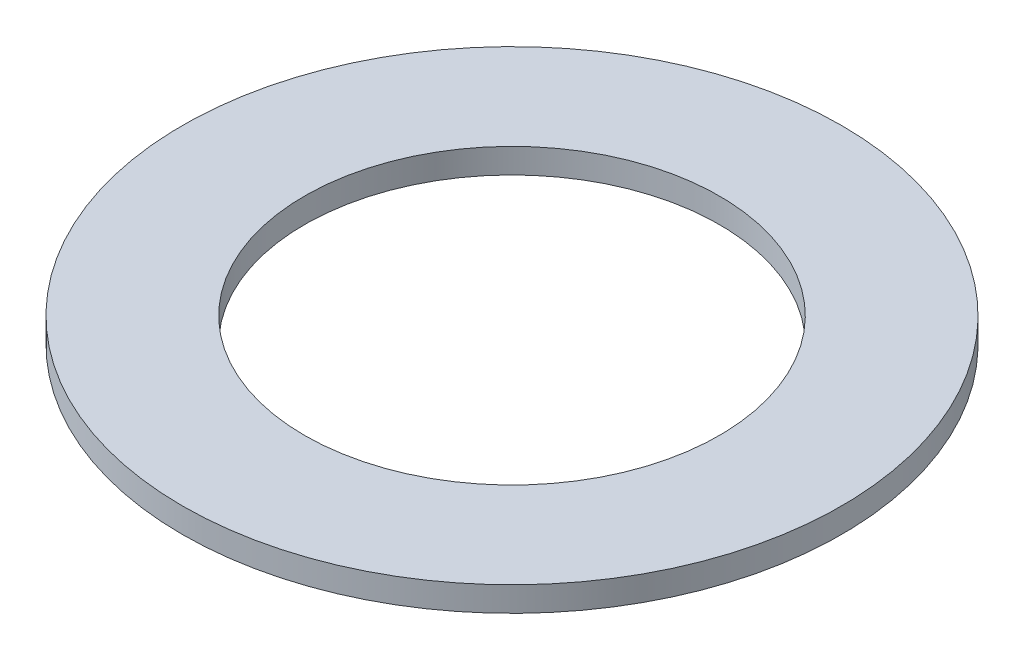
ISO-10303-21;
HEADER;
FILE_DESCRIPTION(('STEP AP214'),'2;1');
FILE_NAME('part.step','',(''),(''),'','','');
FILE_SCHEMA(('AUTOMOTIVE_DESIGN { 1 0 10303 214 1 1 1 1 }'));
ENDSEC;
DATA;
#1=APPLICATION_CONTEXT('core data for automotive mechanical design processes');
#2=APPLICATION_PROTOCOL_DEFINITION('international standard','automotive_design',2000,#1);
#3=PRODUCT_CONTEXT('',#1,'mechanical');
#4=PRODUCT('Part','Part','',(#3));
#5=PRODUCT_RELATED_PRODUCT_CATEGORY('part','',(#4));
#6=PRODUCT_DEFINITION_FORMATION('','',#4);
#7=PRODUCT_DEFINITION_CONTEXT('part definition',#1,'design');
#8=PRODUCT_DEFINITION('design','',#6,#7);
#9=PRODUCT_DEFINITION_SHAPE('','',#8);
#10=(LENGTH_UNIT() NAMED_UNIT(*) SI_UNIT(.MILLI.,.METRE.));
#11=(NAMED_UNIT(*) PLANE_ANGLE_UNIT() SI_UNIT($,.RADIAN.));
#12=(NAMED_UNIT(*) SI_UNIT($,.STERADIAN.) SOLID_ANGLE_UNIT());
#13=UNCERTAINTY_MEASURE_WITH_UNIT(LENGTH_MEASURE(1.E-05),#10,'distance_accuracy_value','');
#14=(GEOMETRIC_REPRESENTATION_CONTEXT(3) GLOBAL_UNCERTAINTY_ASSIGNED_CONTEXT((#13)) GLOBAL_UNIT_ASSIGNED_CONTEXT((#10,
#11,#12)) REPRESENTATION_CONTEXT('',''));
#15=CARTESIAN_POINT('',(0.,0.,0.));
#16=DIRECTION('',(0.,0.,1.));
#17=DIRECTION('',(1.,0.,0.));
#18=AXIS2_PLACEMENT_3D('',#15,#16,#17);
#19=CARTESIAN_POINT('',(0.,0.43,0.));
#20=DIRECTION('',(0.,1.,0.));
#21=DIRECTION('',(0.,0.,1.));
#22=AXIS2_PLACEMENT_3D('',#19,#20,#21);
#23=PLANE('',#22);
#24=CARTESIAN_POINT('',(0.,0.43,0.));
#25=DIRECTION('',(0.,1.,0.));
#26=DIRECTION('',(0.,0.,1.));
#27=AXIS2_PLACEMENT_3D('',#24,#25,#26);
#28=CIRCLE('',#27,5.72);
#29=CARTESIAN_POINT('',(0.,0.43,5.72));
#30=VERTEX_POINT('',#29);
#31=EDGE_CURVE('E10',#30,#30,#28,.T.);
#32=ORIENTED_EDGE('',*,*,#31,.T.);
#33=EDGE_LOOP('',(#32));
#34=FACE_BOUND('',#33,.T.);
#35=CARTESIAN_POINT('',(0.,0.43,0.));
#36=DIRECTION('',(0.,1.,0.));
#37=DIRECTION('',(0.,0.,1.));
#38=AXIS2_PLACEMENT_3D('',#35,#36,#37);
#39=CIRCLE('',#38,3.6);
#40=CARTESIAN_POINT('',(0.,0.43,3.6));
#41=VERTEX_POINT('',#40);
#42=EDGE_CURVE('E48',#41,#41,#39,.T.);
#43=ORIENTED_EDGE('',*,*,#42,.F.);
#44=EDGE_LOOP('',(#43));
#45=FACE_BOUND('',#44,.T.);
#46=ADVANCED_FACE('F37',(#34,#45),#23,.T.);
#47=CARTESIAN_POINT('',(0.,0.,0.));
#48=DIRECTION('',(0.,1.,0.));
#49=DIRECTION('',(0.,0.,1.));
#50=AXIS2_PLACEMENT_3D('',#47,#48,#49);
#51=PLANE('',#50);
#52=CARTESIAN_POINT('',(0.,0.,0.));
#53=DIRECTION('',(0.,1.,0.));
#54=DIRECTION('',(0.,0.,1.));
#55=AXIS2_PLACEMENT_3D('',#52,#53,#54);
#56=CIRCLE('',#55,5.72);
#57=CARTESIAN_POINT('',(0.,0.,5.72));
#58=VERTEX_POINT('',#57);
#59=EDGE_CURVE('E41',#58,#58,#56,.T.);
#60=ORIENTED_EDGE('',*,*,#59,.F.);
#61=EDGE_LOOP('',(#60));
#62=FACE_BOUND('',#61,.T.);
#63=CARTESIAN_POINT('',(0.,0.,0.));
#64=DIRECTION('',(0.,1.,0.));
#65=DIRECTION('',(0.,0.,1.));
#66=AXIS2_PLACEMENT_3D('',#63,#64,#65);
#67=CIRCLE('',#66,3.6);
#68=CARTESIAN_POINT('',(0.,0.,3.6));
#69=VERTEX_POINT('',#68);
#70=EDGE_CURVE('E50',#69,#69,#67,.T.);
#71=ORIENTED_EDGE('',*,*,#70,.T.);
#72=EDGE_LOOP('',(#71));
#73=FACE_BOUND('',#72,.T.);
#74=ADVANCED_FACE('F60',(#62,#73),#51,.F.);
#75=CARTESIAN_POINT('',(0.,0.43,0.));
#76=DIRECTION('',(0.,-1.,0.));
#77=DIRECTION('',(0.,0.,-1.));
#78=AXIS2_PLACEMENT_3D('',#75,#76,#77);
#79=CYLINDRICAL_SURFACE('',#78,5.72);
#80=ORIENTED_EDGE('',*,*,#31,.F.);
#81=EDGE_LOOP('',(#80));
#82=FACE_BOUND('',#81,.T.);
#83=ORIENTED_EDGE('',*,*,#59,.T.);
#84=EDGE_LOOP('',(#83));
#85=FACE_BOUND('',#84,.T.);
#86=ADVANCED_FACE('F39',(#82,#85),#79,.T.);
#87=CARTESIAN_POINT('',(0.,0.43,0.));
#88=DIRECTION('',(0.,-1.,0.));
#89=DIRECTION('',(0.,0.,-1.));
#90=AXIS2_PLACEMENT_3D('',#87,#88,#89);
#91=CYLINDRICAL_SURFACE('',#90,3.6);
#92=ORIENTED_EDGE('',*,*,#42,.T.);
#93=EDGE_LOOP('',(#92));
#94=FACE_BOUND('',#93,.T.);
#95=ORIENTED_EDGE('',*,*,#70,.F.);
#96=EDGE_LOOP('',(#95));
#97=FACE_BOUND('',#96,.T.);
#98=ADVANCED_FACE('F56',(#94,#97),#91,.F.);
#99=CLOSED_SHELL('',(#46,#74,#86,#98));
#100=MANIFOLD_SOLID_BREP('B2',#99);
#101=ADVANCED_BREP_SHAPE_REPRESENTATION('',(#18,#100),#14);
#102=SHAPE_DEFINITION_REPRESENTATION(#9,#101);
ENDSEC;
END-ISO-10303-21;
